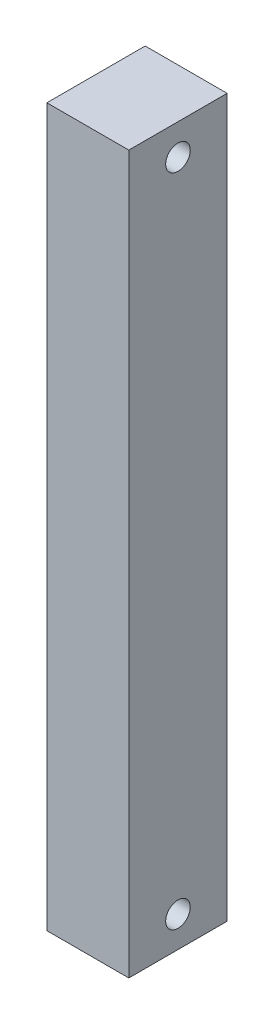
ISO-10303-21;
HEADER;
FILE_DESCRIPTION(('STEP AP214'),'2;1');
FILE_NAME('part.step','',(''),(''),'','','');
FILE_SCHEMA(('AUTOMOTIVE_DESIGN { 1 0 10303 214 1 1 1 1 }'));
ENDSEC;
DATA;
#1=APPLICATION_CONTEXT('core data for automotive mechanical design processes');
#2=APPLICATION_PROTOCOL_DEFINITION('international standard','automotive_design',2000,#1);
#3=PRODUCT_CONTEXT('',#1,'mechanical');
#4=PRODUCT('Part','Part','',(#3));
#5=PRODUCT_RELATED_PRODUCT_CATEGORY('part','',(#4));
#6=PRODUCT_DEFINITION_FORMATION('','',#4);
#7=PRODUCT_DEFINITION_CONTEXT('part definition',#1,'design');
#8=PRODUCT_DEFINITION('design','',#6,#7);
#9=PRODUCT_DEFINITION_SHAPE('','',#8);
#10=(LENGTH_UNIT() NAMED_UNIT(*) SI_UNIT(.MILLI.,.METRE.));
#11=(NAMED_UNIT(*) PLANE_ANGLE_UNIT() SI_UNIT($,.RADIAN.));
#12=(NAMED_UNIT(*) SI_UNIT($,.STERADIAN.) SOLID_ANGLE_UNIT());
#13=UNCERTAINTY_MEASURE_WITH_UNIT(LENGTH_MEASURE(1.E-05),#10,'distance_accuracy_value','');
#14=(GEOMETRIC_REPRESENTATION_CONTEXT(3) GLOBAL_UNCERTAINTY_ASSIGNED_CONTEXT((#13)) GLOBAL_UNIT_ASSIGNED_CONTEXT((#10,
#11,#12)) REPRESENTATION_CONTEXT('',''));
#15=CARTESIAN_POINT('',(0.,0.,0.));
#16=DIRECTION('',(0.,0.,1.));
#17=DIRECTION('',(1.,0.,0.));
#18=AXIS2_PLACEMENT_3D('',#15,#16,#17);
#19=CARTESIAN_POINT('',(5.,0.,0.));
#20=DIRECTION('',(1.,0.,0.));
#21=DIRECTION('',(0.,0.,-1.));
#22=AXIS2_PLACEMENT_3D('',#19,#20,#21);
#23=PLANE('',#22);
#24=CARTESIAN_POINT('',(5.,80.,0.));
#25=DIRECTION('',(1.,0.,0.));
#26=DIRECTION('',(0.,0.,-1.));
#27=AXIS2_PLACEMENT_3D('',#24,#25,#26);
#28=CIRCLE('',#27,1.5);
#29=CARTESIAN_POINT('',(5.,80.,-1.5));
#30=VERTEX_POINT('',#29);
#31=EDGE_CURVE('E106',#30,#30,#28,.T.);
#32=ORIENTED_EDGE('',*,*,#31,.F.);
#33=EDGE_LOOP('',(#32));
#34=FACE_BOUND('',#33,.T.);
#35=DIRECTION('',(0.,-1.,0.));
#36=VECTOR('',#35,1.);
#37=CARTESIAN_POINT('',(5.,-3.75,6.));
#38=LINE('',#37,#36);
#39=CARTESIAN_POINT('',(5.,83.75,6.));
#40=VERTEX_POINT('',#39);
#41=CARTESIAN_POINT('',(5.,-3.75,6.));
#42=VERTEX_POINT('',#41);
#43=EDGE_CURVE('E91',#40,#42,#38,.T.);
#44=ORIENTED_EDGE('',*,*,#43,.T.);
#45=DIRECTION('',(0.,0.,-1.));
#46=VECTOR('',#45,1.);
#47=CARTESIAN_POINT('',(5.,-3.75,-6.));
#48=LINE('',#47,#46);
#49=CARTESIAN_POINT('',(5.,-3.75,-6.));
#50=VERTEX_POINT('',#49);
#51=EDGE_CURVE('E86',#42,#50,#48,.T.);
#52=ORIENTED_EDGE('',*,*,#51,.T.);
#53=DIRECTION('',(0.,1.,0.));
#54=VECTOR('',#53,1.);
#55=CARTESIAN_POINT('',(5.,-3.75,-6.));
#56=LINE('',#55,#54);
#57=CARTESIAN_POINT('',(5.,83.75,-6.));
#58=VERTEX_POINT('',#57);
#59=EDGE_CURVE('E89',#50,#58,#56,.T.);
#60=ORIENTED_EDGE('',*,*,#59,.T.);
#61=DIRECTION('',(0.,0.,1.));
#62=VECTOR('',#61,1.);
#63=CARTESIAN_POINT('',(5.,83.75,-6.));
#64=LINE('',#63,#62);
#65=EDGE_CURVE('E56',#58,#40,#64,.T.);
#66=ORIENTED_EDGE('',*,*,#65,.T.);
#67=EDGE_LOOP('',(#44,#52,#60,#66));
#68=FACE_BOUND('',#67,.T.);
#69=CARTESIAN_POINT('',(5.,0.,0.));
#70=DIRECTION('',(1.,0.,0.));
#71=DIRECTION('',(0.,0.,-1.));
#72=AXIS2_PLACEMENT_3D('',#69,#70,#71);
#73=CIRCLE('',#72,1.5);
#74=CARTESIAN_POINT('',(5.,0.,-1.5));
#75=VERTEX_POINT('',#74);
#76=EDGE_CURVE('E121',#75,#75,#73,.T.);
#77=ORIENTED_EDGE('',*,*,#76,.F.);
#78=EDGE_LOOP('',(#77));
#79=FACE_BOUND('',#78,.T.);
#80=ADVANCED_FACE('F39',(#34,#68,#79),#23,.T.);
#81=CARTESIAN_POINT('',(-5.,0.,0.));
#82=DIRECTION('',(1.,0.,0.));
#83=DIRECTION('',(0.,0.,-1.));
#84=AXIS2_PLACEMENT_3D('',#81,#82,#83);
#85=PLANE('',#84);
#86=DIRECTION('',(0.,-1.,0.));
#87=VECTOR('',#86,1.);
#88=CARTESIAN_POINT('',(-5.,-3.75,6.));
#89=LINE('',#88,#87);
#90=CARTESIAN_POINT('',(-5.,83.75,6.));
#91=VERTEX_POINT('',#90);
#92=CARTESIAN_POINT('',(-5.,-3.75,6.));
#93=VERTEX_POINT('',#92);
#94=EDGE_CURVE('E103',#91,#93,#89,.T.);
#95=ORIENTED_EDGE('',*,*,#94,.F.);
#96=DIRECTION('',(0.,0.,1.));
#97=VECTOR('',#96,1.);
#98=CARTESIAN_POINT('',(-5.,83.75,-6.));
#99=LINE('',#98,#97);
#100=CARTESIAN_POINT('',(-5.,83.75,-6.));
#101=VERTEX_POINT('',#100);
#102=EDGE_CURVE('E79',#101,#91,#99,.T.);
#103=ORIENTED_EDGE('',*,*,#102,.F.);
#104=DIRECTION('',(0.,1.,0.));
#105=VECTOR('',#104,1.);
#106=CARTESIAN_POINT('',(-5.,-3.75,-6.));
#107=LINE('',#106,#105);
#108=CARTESIAN_POINT('',(-5.,-3.75,-6.));
#109=VERTEX_POINT('',#108);
#110=EDGE_CURVE('E73',#109,#101,#107,.T.);
#111=ORIENTED_EDGE('',*,*,#110,.F.);
#112=DIRECTION('',(0.,0.,-1.));
#113=VECTOR('',#112,1.);
#114=CARTESIAN_POINT('',(-5.,-3.75,-6.));
#115=LINE('',#114,#113);
#116=EDGE_CURVE('E95',#93,#109,#115,.T.);
#117=ORIENTED_EDGE('',*,*,#116,.F.);
#118=EDGE_LOOP('',(#95,#103,#111,#117));
#119=FACE_BOUND('',#118,.T.);
#120=CARTESIAN_POINT('',(-5.,80.,0.));
#121=DIRECTION('',(1.,0.,0.));
#122=DIRECTION('',(0.,0.,-1.));
#123=AXIS2_PLACEMENT_3D('',#120,#121,#122);
#124=CIRCLE('',#123,1.5);
#125=CARTESIAN_POINT('',(-5.,80.,-1.5));
#126=VERTEX_POINT('',#125);
#127=EDGE_CURVE('E118',#126,#126,#124,.T.);
#128=ORIENTED_EDGE('',*,*,#127,.T.);
#129=EDGE_LOOP('',(#128));
#130=FACE_BOUND('',#129,.T.);
#131=CARTESIAN_POINT('',(-5.,0.,0.));
#132=DIRECTION('',(1.,0.,0.));
#133=DIRECTION('',(0.,0.,-1.));
#134=AXIS2_PLACEMENT_3D('',#131,#132,#133);
#135=CIRCLE('',#134,1.5);
#136=CARTESIAN_POINT('',(-5.,0.,-1.5));
#137=VERTEX_POINT('',#136);
#138=EDGE_CURVE('E124',#137,#137,#135,.T.);
#139=ORIENTED_EDGE('',*,*,#138,.T.);
#140=EDGE_LOOP('',(#139));
#141=FACE_BOUND('',#140,.T.);
#142=ADVANCED_FACE('F114',(#119,#130,#141),#85,.F.);
#143=CARTESIAN_POINT('',(5.,-3.75,6.));
#144=DIRECTION('',(0.,0.,-1.));
#145=DIRECTION('',(-1.,0.,0.));
#146=AXIS2_PLACEMENT_3D('',#143,#144,#145);
#147=PLANE('',#146);
#148=ORIENTED_EDGE('',*,*,#94,.T.);
#149=DIRECTION('',(-1.,0.,0.));
#150=VECTOR('',#149,1.);
#151=CARTESIAN_POINT('',(5.,-3.75,6.));
#152=LINE('',#151,#150);
#153=EDGE_CURVE('E11',#42,#93,#152,.T.);
#154=ORIENTED_EDGE('',*,*,#153,.F.);
#155=ORIENTED_EDGE('',*,*,#43,.F.);
#156=DIRECTION('',(-1.,0.,0.));
#157=VECTOR('',#156,1.);
#158=CARTESIAN_POINT('',(5.,83.75,6.));
#159=LINE('',#158,#157);
#160=EDGE_CURVE('E99',#40,#91,#159,.T.);
#161=ORIENTED_EDGE('',*,*,#160,.T.);
#162=EDGE_LOOP('',(#148,#154,#155,#161));
#163=FACE_BOUND('',#162,.T.);
#164=ADVANCED_FACE('F41',(#163),#147,.F.);
#165=CARTESIAN_POINT('',(5.,-3.75,-6.));
#166=DIRECTION('',(0.,1.,0.));
#167=DIRECTION('',(0.,0.,1.));
#168=AXIS2_PLACEMENT_3D('',#165,#166,#167);
#169=PLANE('',#168);
#170=ORIENTED_EDGE('',*,*,#116,.T.);
#171=DIRECTION('',(-1.,0.,0.));
#172=VECTOR('',#171,1.);
#173=CARTESIAN_POINT('',(5.,-3.75,-6.));
#174=LINE('',#173,#172);
#175=EDGE_CURVE('E48',#50,#109,#174,.T.);
#176=ORIENTED_EDGE('',*,*,#175,.F.);
#177=ORIENTED_EDGE('',*,*,#51,.F.);
#178=ORIENTED_EDGE('',*,*,#153,.T.);
#179=EDGE_LOOP('',(#170,#176,#177,#178));
#180=FACE_BOUND('',#179,.T.);
#181=ADVANCED_FACE('F94',(#180),#169,.F.);
#182=CARTESIAN_POINT('',(5.,-3.75,-6.));
#183=DIRECTION('',(0.,0.,1.));
#184=DIRECTION('',(1.,0.,0.));
#185=AXIS2_PLACEMENT_3D('',#182,#183,#184);
#186=PLANE('',#185);
#187=ORIENTED_EDGE('',*,*,#110,.T.);
#188=DIRECTION('',(-1.,0.,0.));
#189=VECTOR('',#188,1.);
#190=CARTESIAN_POINT('',(5.,83.75,-6.));
#191=LINE('',#190,#189);
#192=EDGE_CURVE('E96',#58,#101,#191,.T.);
#193=ORIENTED_EDGE('',*,*,#192,.F.);
#194=ORIENTED_EDGE('',*,*,#59,.F.);
#195=ORIENTED_EDGE('',*,*,#175,.T.);
#196=EDGE_LOOP('',(#187,#193,#194,#195));
#197=FACE_BOUND('',#196,.T.);
#198=ADVANCED_FACE('F97',(#197),#186,.F.);
#199=CARTESIAN_POINT('',(5.,83.75,-6.));
#200=DIRECTION('',(0.,-1.,0.));
#201=DIRECTION('',(0.,0.,-1.));
#202=AXIS2_PLACEMENT_3D('',#199,#200,#201);
#203=PLANE('',#202);
#204=ORIENTED_EDGE('',*,*,#102,.T.);
#205=ORIENTED_EDGE('',*,*,#160,.F.);
#206=ORIENTED_EDGE('',*,*,#65,.F.);
#207=ORIENTED_EDGE('',*,*,#192,.T.);
#208=EDGE_LOOP('',(#204,#205,#206,#207));
#209=FACE_BOUND('',#208,.T.);
#210=ADVANCED_FACE('F111',(#209),#203,.F.);
#211=CARTESIAN_POINT('',(5.,80.,0.));
#212=DIRECTION('',(-1.,0.,0.));
#213=DIRECTION('',(0.,0.,1.));
#214=AXIS2_PLACEMENT_3D('',#211,#212,#213);
#215=CYLINDRICAL_SURFACE('',#214,1.5);
#216=ORIENTED_EDGE('',*,*,#31,.T.);
#217=EDGE_LOOP('',(#216));
#218=FACE_BOUND('',#217,.T.);
#219=ORIENTED_EDGE('',*,*,#127,.F.);
#220=EDGE_LOOP('',(#219));
#221=FACE_BOUND('',#220,.T.);
#222=ADVANCED_FACE('F141',(#218,#221),#215,.F.);
#223=CARTESIAN_POINT('',(5.,0.,0.));
#224=DIRECTION('',(-1.,0.,0.));
#225=DIRECTION('',(0.,0.,1.));
#226=AXIS2_PLACEMENT_3D('',#223,#224,#225);
#227=CYLINDRICAL_SURFACE('',#226,1.5);
#228=ORIENTED_EDGE('',*,*,#76,.T.);
#229=EDGE_LOOP('',(#228));
#230=FACE_BOUND('',#229,.T.);
#231=ORIENTED_EDGE('',*,*,#138,.F.);
#232=EDGE_LOOP('',(#231));
#233=FACE_BOUND('',#232,.T.);
#234=ADVANCED_FACE('F130',(#230,#233),#227,.F.);
#235=CLOSED_SHELL('',(#80,#142,#164,#181,#198,#210,#222,#234));
#236=MANIFOLD_SOLID_BREP('B2',#235);
#237=ADVANCED_BREP_SHAPE_REPRESENTATION('',(#18,#236),#14);
#238=SHAPE_DEFINITION_REPRESENTATION(#9,#237);
ENDSEC;
END-ISO-10303-21;
